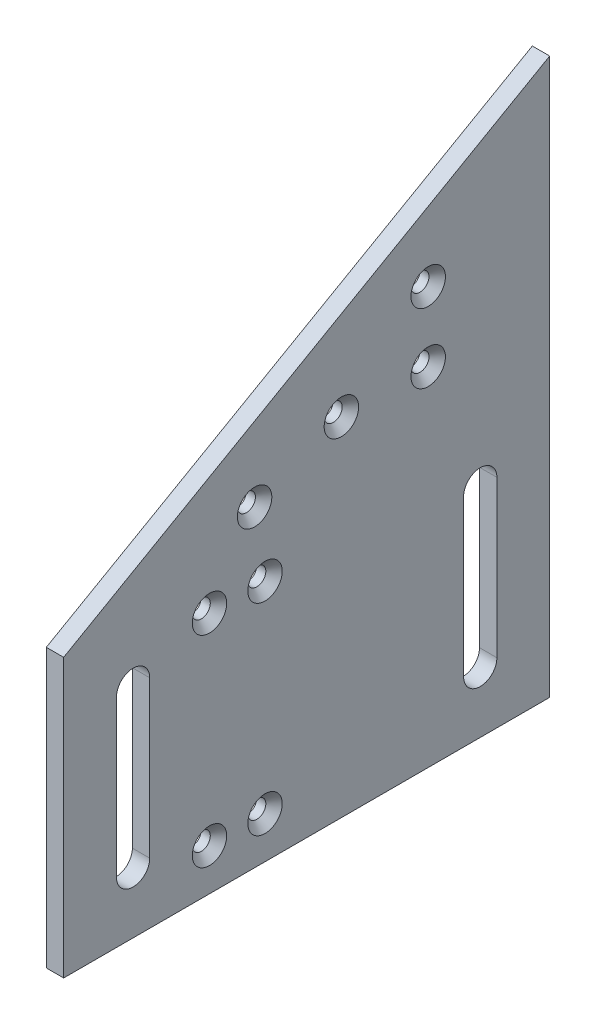
ISO-10303-21;
HEADER;
FILE_DESCRIPTION(('STEP AP214'),'2;1');
FILE_NAME('part.step','',(''),(''),'','','');
FILE_SCHEMA(('AUTOMOTIVE_DESIGN { 1 0 10303 214 1 1 1 1 }'));
ENDSEC;
DATA;
#1=APPLICATION_CONTEXT('core data for automotive mechanical design processes');
#2=APPLICATION_PROTOCOL_DEFINITION('international standard','automotive_design',2000,#1);
#3=PRODUCT_CONTEXT('',#1,'mechanical');
#4=PRODUCT('Part','Part','',(#3));
#5=PRODUCT_RELATED_PRODUCT_CATEGORY('part','',(#4));
#6=PRODUCT_DEFINITION_FORMATION('','',#4);
#7=PRODUCT_DEFINITION_CONTEXT('part definition',#1,'design');
#8=PRODUCT_DEFINITION('design','',#6,#7);
#9=PRODUCT_DEFINITION_SHAPE('','',#8);
#10=(LENGTH_UNIT() NAMED_UNIT(*) SI_UNIT(.MILLI.,.METRE.));
#11=(NAMED_UNIT(*) PLANE_ANGLE_UNIT() SI_UNIT($,.RADIAN.));
#12=(NAMED_UNIT(*) SI_UNIT($,.STERADIAN.) SOLID_ANGLE_UNIT());
#13=UNCERTAINTY_MEASURE_WITH_UNIT(LENGTH_MEASURE(1.E-05),#10,'distance_accuracy_value','');
#14=(GEOMETRIC_REPRESENTATION_CONTEXT(3) GLOBAL_UNCERTAINTY_ASSIGNED_CONTEXT((#13)) GLOBAL_UNIT_ASSIGNED_CONTEXT((#10,
#11,#12)) REPRESENTATION_CONTEXT('',''));
#15=CARTESIAN_POINT('',(0.,0.,0.));
#16=DIRECTION('',(0.,0.,1.));
#17=DIRECTION('',(1.,0.,0.));
#18=AXIS2_PLACEMENT_3D('',#15,#16,#17);
#19=CARTESIAN_POINT('',(6.35,22.225,-17.4843844536032));
#20=DIRECTION('',(-1.,0.,0.));
#21=DIRECTION('',(0.,0.,1.));
#22=AXIS2_PLACEMENT_3D('',#19,#20,#21);
#23=CYLINDRICAL_SURFACE('',#22,6.08383233532937);
#24=CARTESIAN_POINT('',(0.,22.225,-17.4843844536032));
#25=DIRECTION('',(1.,0.,0.));
#26=DIRECTION('',(0.,0.,-1.));
#27=AXIS2_PLACEMENT_3D('',#24,#25,#26);
#28=CIRCLE('',#27,6.08383233532937);
#29=CARTESIAN_POINT('',(0.,22.225,-23.5682167889326));
#30=VERTEX_POINT('',#29);
#31=CARTESIAN_POINT('',(0.,22.225,-11.4005521182738));
#32=VERTEX_POINT('',#31);
#33=EDGE_CURVE('E188',#30,#32,#28,.F.);
#34=ORIENTED_EDGE('',*,*,#33,.T.);
#35=DIRECTION('',(-1.,0.,0.));
#36=VECTOR('',#35,1.);
#37=CARTESIAN_POINT('',(6.35,22.225,-11.4005521182738));
#38=LINE('',#37,#36);
#39=CARTESIAN_POINT('',(6.35,22.225,-11.4005521182738));
#40=VERTEX_POINT('',#39);
#41=EDGE_CURVE('E11',#40,#32,#38,.T.);
#42=ORIENTED_EDGE('',*,*,#41,.F.);
#43=CARTESIAN_POINT('',(6.35,22.225,-17.4843844536032));
#44=DIRECTION('',(1.,0.,0.));
#45=DIRECTION('',(0.,0.,-1.));
#46=AXIS2_PLACEMENT_3D('',#43,#44,#45);
#47=CIRCLE('',#46,6.08383233532937);
#48=CARTESIAN_POINT('',(6.35,22.225,-23.5682167889326));
#49=VERTEX_POINT('',#48);
#50=EDGE_CURVE('E146',#49,#40,#47,.F.);
#51=ORIENTED_EDGE('',*,*,#50,.F.);
#52=DIRECTION('',(-1.,0.,0.));
#53=VECTOR('',#52,1.);
#54=CARTESIAN_POINT('',(6.35,22.225,-23.5682167889326));
#55=LINE('',#54,#53);
#56=EDGE_CURVE('E62',#49,#30,#55,.T.);
#57=ORIENTED_EDGE('',*,*,#56,.T.);
#58=EDGE_LOOP('',(#34,#42,#51,#57));
#59=FACE_BOUND('',#58,.T.);
#60=ADVANCED_FACE('F43',(#59),#23,.F.);
#61=CARTESIAN_POINT('',(6.35,0.,-11.4005521182738));
#62=DIRECTION('',(0.,0.,1.));
#63=DIRECTION('',(0.,-1.,0.));
#64=AXIS2_PLACEMENT_3D('',#61,#62,#63);
#65=PLANE('',#64);
#66=DIRECTION('',(0.,1.,0.));
#67=VECTOR('',#66,1.);
#68=CARTESIAN_POINT('',(0.,0.,-11.4005521182738));
#69=LINE('',#68,#67);
#70=CARTESIAN_POINT('',(0.,79.375,-11.4005521182738));
#71=VERTEX_POINT('',#70);
#72=EDGE_CURVE('E152',#32,#71,#69,.T.);
#73=ORIENTED_EDGE('',*,*,#72,.T.);
#74=DIRECTION('',(-1.,0.,0.));
#75=VECTOR('',#74,1.);
#76=CARTESIAN_POINT('',(6.35,79.375,-11.4005521182738));
#77=LINE('',#76,#75);
#78=CARTESIAN_POINT('',(6.35,79.375,-11.4005521182738));
#79=VERTEX_POINT('',#78);
#80=EDGE_CURVE('E53',#79,#71,#77,.T.);
#81=ORIENTED_EDGE('',*,*,#80,.F.);
#82=DIRECTION('',(0.,1.,0.));
#83=VECTOR('',#82,1.);
#84=CARTESIAN_POINT('',(6.35,0.,-11.4005521182738));
#85=LINE('',#84,#83);
#86=EDGE_CURVE('E140',#40,#79,#85,.T.);
#87=ORIENTED_EDGE('',*,*,#86,.F.);
#88=ORIENTED_EDGE('',*,*,#41,.T.);
#89=EDGE_LOOP('',(#73,#81,#87,#88));
#90=FACE_BOUND('',#89,.T.);
#91=ADVANCED_FACE('F151',(#90),#65,.F.);
#92=CARTESIAN_POINT('',(6.35,79.375,-17.4843844536032));
#93=DIRECTION('',(-1.,0.,0.));
#94=DIRECTION('',(0.,0.,1.));
#95=AXIS2_PLACEMENT_3D('',#92,#93,#94);
#96=CYLINDRICAL_SURFACE('',#95,6.08383233532938);
#97=CARTESIAN_POINT('',(0.,79.375,-17.4843844536032));
#98=DIRECTION('',(1.,0.,0.));
#99=DIRECTION('',(0.,0.,-1.));
#100=AXIS2_PLACEMENT_3D('',#97,#98,#99);
#101=CIRCLE('',#100,6.08383233532938);
#102=CARTESIAN_POINT('',(0.,79.375,-23.5682167889326));
#103=VERTEX_POINT('',#102);
#104=EDGE_CURVE('E191',#71,#103,#101,.F.);
#105=ORIENTED_EDGE('',*,*,#104,.T.);
#106=DIRECTION('',(-1.,0.,0.));
#107=VECTOR('',#106,1.);
#108=CARTESIAN_POINT('',(6.35,79.375,-23.5682167889326));
#109=LINE('',#108,#107);
#110=CARTESIAN_POINT('',(6.35,79.375,-23.5682167889326));
#111=VERTEX_POINT('',#110);
#112=EDGE_CURVE('E101',#111,#103,#109,.T.);
#113=ORIENTED_EDGE('',*,*,#112,.F.);
#114=CARTESIAN_POINT('',(6.35,79.375,-17.4843844536032));
#115=DIRECTION('',(1.,0.,0.));
#116=DIRECTION('',(0.,0.,-1.));
#117=AXIS2_PLACEMENT_3D('',#114,#115,#116);
#118=CIRCLE('',#117,6.08383233532938);
#119=EDGE_CURVE('E145',#79,#111,#118,.F.);
#120=ORIENTED_EDGE('',*,*,#119,.F.);
#121=ORIENTED_EDGE('',*,*,#80,.T.);
#122=EDGE_LOOP('',(#105,#113,#120,#121));
#123=FACE_BOUND('',#122,.T.);
#124=ADVANCED_FACE('F156',(#123),#96,.F.);
#125=CARTESIAN_POINT('',(6.35,0.,103.431783211067));
#126=DIRECTION('',(0.,0.,1.));
#127=DIRECTION('',(1.,0.,0.));
#128=AXIS2_PLACEMENT_3D('',#125,#126,#127);
#129=PLANE('',#128);
#130=DIRECTION('',(0.,1.,0.));
#131=VECTOR('',#130,1.);
#132=CARTESIAN_POINT('',(0.,0.,103.431783211067));
#133=LINE('',#132,#131);
#134=CARTESIAN_POINT('',(0.,22.225,103.431783211067));
#135=VERTEX_POINT('',#134);
#136=CARTESIAN_POINT('',(0.,79.375,103.431783211067));
#137=VERTEX_POINT('',#136);
#138=EDGE_CURVE('E176',#135,#137,#133,.T.);
#139=ORIENTED_EDGE('',*,*,#138,.F.);
#140=DIRECTION('',(-1.,0.,0.));
#141=VECTOR('',#140,1.);
#142=CARTESIAN_POINT('',(6.35,22.225,103.431783211067));
#143=LINE('',#142,#141);
#144=CARTESIAN_POINT('',(6.35,22.225,103.431783211067));
#145=VERTEX_POINT('',#144);
#146=EDGE_CURVE('E198',#145,#135,#143,.T.);
#147=ORIENTED_EDGE('',*,*,#146,.F.);
#148=DIRECTION('',(0.,1.,0.));
#149=VECTOR('',#148,1.);
#150=CARTESIAN_POINT('',(6.35,0.,103.431783211067));
#151=LINE('',#150,#149);
#152=CARTESIAN_POINT('',(6.35,79.375,103.431783211067));
#153=VERTEX_POINT('',#152);
#154=EDGE_CURVE('E234',#145,#153,#151,.T.);
#155=ORIENTED_EDGE('',*,*,#154,.T.);
#156=DIRECTION('',(-1.,0.,0.));
#157=VECTOR('',#156,1.);
#158=CARTESIAN_POINT('',(6.35,79.375,103.431783211067));
#159=LINE('',#158,#157);
#160=EDGE_CURVE('E200',#153,#137,#159,.T.);
#161=ORIENTED_EDGE('',*,*,#160,.T.);
#162=EDGE_LOOP('',(#139,#147,#155,#161));
#163=FACE_BOUND('',#162,.T.);
#164=ADVANCED_FACE('F262',(#163),#129,.T.);
#165=CARTESIAN_POINT('',(6.35,22.225,109.515615546397));
#166=DIRECTION('',(-1.,0.,0.));
#167=DIRECTION('',(0.,0.,1.));
#168=AXIS2_PLACEMENT_3D('',#165,#166,#167);
#169=CYLINDRICAL_SURFACE('',#168,6.08383233532937);
#170=CARTESIAN_POINT('',(0.,22.225,109.515615546397));
#171=DIRECTION('',(1.,0.,0.));
#172=DIRECTION('',(0.,0.,-1.));
#173=AXIS2_PLACEMENT_3D('',#170,#171,#172);
#174=CIRCLE('',#173,6.08383233532937);
#175=CARTESIAN_POINT('',(0.,22.225,115.599447881726));
#176=VERTEX_POINT('',#175);
#177=EDGE_CURVE('E179',#176,#135,#174,.T.);
#178=ORIENTED_EDGE('',*,*,#177,.F.);
#179=DIRECTION('',(-1.,0.,0.));
#180=VECTOR('',#179,1.);
#181=CARTESIAN_POINT('',(6.35,22.225,115.599447881726));
#182=LINE('',#181,#180);
#183=CARTESIAN_POINT('',(6.35,22.225,115.599447881726));
#184=VERTEX_POINT('',#183);
#185=EDGE_CURVE('E204',#184,#176,#182,.T.);
#186=ORIENTED_EDGE('',*,*,#185,.F.);
#187=CARTESIAN_POINT('',(6.35,22.225,109.515615546397));
#188=DIRECTION('',(1.,0.,0.));
#189=DIRECTION('',(0.,0.,-1.));
#190=AXIS2_PLACEMENT_3D('',#187,#188,#189);
#191=CIRCLE('',#190,6.08383233532937);
#192=EDGE_CURVE('E237',#184,#145,#191,.T.);
#193=ORIENTED_EDGE('',*,*,#192,.T.);
#194=ORIENTED_EDGE('',*,*,#146,.T.);
#195=EDGE_LOOP('',(#178,#186,#193,#194));
#196=FACE_BOUND('',#195,.T.);
#197=ADVANCED_FACE('F264',(#196),#169,.F.);
#198=CARTESIAN_POINT('',(6.35,0.,115.599447881726));
#199=DIRECTION('',(0.,0.,1.));
#200=DIRECTION('',(1.,0.,0.));
#201=AXIS2_PLACEMENT_3D('',#198,#199,#200);
#202=PLANE('',#201);
#203=DIRECTION('',(0.,1.,0.));
#204=VECTOR('',#203,1.);
#205=CARTESIAN_POINT('',(0.,0.,115.599447881726));
#206=LINE('',#205,#204);
#207=CARTESIAN_POINT('',(0.,79.375,115.599447881726));
#208=VERTEX_POINT('',#207);
#209=EDGE_CURVE('E182',#176,#208,#206,.T.);
#210=ORIENTED_EDGE('',*,*,#209,.T.);
#211=DIRECTION('',(-1.,0.,0.));
#212=VECTOR('',#211,1.);
#213=CARTESIAN_POINT('',(6.35,79.375,115.599447881726));
#214=LINE('',#213,#212);
#215=CARTESIAN_POINT('',(6.35,79.375,115.599447881726));
#216=VERTEX_POINT('',#215);
#217=EDGE_CURVE('E202',#216,#208,#214,.T.);
#218=ORIENTED_EDGE('',*,*,#217,.F.);
#219=DIRECTION('',(0.,1.,0.));
#220=VECTOR('',#219,1.);
#221=CARTESIAN_POINT('',(6.35,0.,115.599447881726));
#222=LINE('',#221,#220);
#223=EDGE_CURVE('E243',#184,#216,#222,.T.);
#224=ORIENTED_EDGE('',*,*,#223,.F.);
#225=ORIENTED_EDGE('',*,*,#185,.T.);
#226=EDGE_LOOP('',(#210,#218,#224,#225));
#227=FACE_BOUND('',#226,.T.);
#228=ADVANCED_FACE('F256',(#227),#202,.F.);
#229=CARTESIAN_POINT('',(6.35,134.708265158448,76.9761515191131));
#230=DIRECTION('',(0.,0.868243142124459,0.496138938356834));
#231=DIRECTION('',(0.,-0.496138938356834,0.868243142124459));
#232=AXIS2_PLACEMENT_3D('',#229,#230,#231);
#233=PLANE('',#232);
#234=DIRECTION('',(0.,0.496138938356834,-0.868243142124459));
#235=VECTOR('',#234,1.);
#236=CARTESIAN_POINT('',(0.,134.708265158448,76.9761515191131));
#237=LINE('',#236,#235);
#238=CARTESIAN_POINT('',(0.,101.6,134.915615546397));
#239=VERTEX_POINT('',#238);
#240=CARTESIAN_POINT('',(0.,203.2,-42.8843844536032));
#241=VERTEX_POINT('',#240);
#242=EDGE_CURVE('E163',#239,#241,#237,.T.);
#243=ORIENTED_EDGE('',*,*,#242,.F.);
#244=DIRECTION('',(-1.,0.,0.));
#245=VECTOR('',#244,1.);
#246=CARTESIAN_POINT('',(6.35,101.6,134.915615546397));
#247=LINE('',#246,#245);
#248=CARTESIAN_POINT('',(6.35,101.6,134.915615546397));
#249=VERTEX_POINT('',#248);
#250=EDGE_CURVE('E47',#249,#239,#247,.T.);
#251=ORIENTED_EDGE('',*,*,#250,.F.);
#252=DIRECTION('',(0.,0.496138938356834,-0.868243142124459));
#253=VECTOR('',#252,1.);
#254=CARTESIAN_POINT('',(6.35,134.708265158448,76.9761515191131));
#255=LINE('',#254,#253);
#256=CARTESIAN_POINT('',(6.35,203.2,-42.8843844536032));
#257=VERTEX_POINT('',#256);
#258=EDGE_CURVE('E196',#249,#257,#255,.T.);
#259=ORIENTED_EDGE('',*,*,#258,.T.);
#260=DIRECTION('',(-1.,0.,0.));
#261=VECTOR('',#260,1.);
#262=CARTESIAN_POINT('',(6.35,203.2,-42.8843844536032));
#263=LINE('',#262,#261);
#264=EDGE_CURVE('E159',#257,#241,#263,.T.);
#265=ORIENTED_EDGE('',*,*,#264,.T.);
#266=EDGE_LOOP('',(#243,#251,#259,#265));
#267=FACE_BOUND('',#266,.T.);
#268=ADVANCED_FACE('F45',(#267),#233,.T.);
#269=CARTESIAN_POINT('',(6.35,0.,134.915615546397));
#270=DIRECTION('',(0.,0.,1.));
#271=DIRECTION('',(1.,0.,0.));
#272=AXIS2_PLACEMENT_3D('',#269,#270,#271);
#273=PLANE('',#272);
#274=DIRECTION('',(0.,1.,0.));
#275=VECTOR('',#274,1.);
#276=CARTESIAN_POINT('',(0.,0.,134.915615546397));
#277=LINE('',#276,#275);
#278=CARTESIAN_POINT('',(0.,0.,134.915615546397));
#279=VERTEX_POINT('',#278);
#280=EDGE_CURVE('E166',#279,#239,#277,.T.);
#281=ORIENTED_EDGE('',*,*,#280,.F.);
#282=DIRECTION('',(-1.,0.,0.));
#283=VECTOR('',#282,1.);
#284=CARTESIAN_POINT('',(6.35,0.,134.915615546397));
#285=LINE('',#284,#283);
#286=CARTESIAN_POINT('',(6.35,0.,134.915615546397));
#287=VERTEX_POINT('',#286);
#288=EDGE_CURVE('E209',#287,#279,#285,.T.);
#289=ORIENTED_EDGE('',*,*,#288,.F.);
#290=DIRECTION('',(0.,1.,0.));
#291=VECTOR('',#290,1.);
#292=CARTESIAN_POINT('',(6.35,0.,134.915615546397));
#293=LINE('',#292,#291);
#294=EDGE_CURVE('E218',#287,#249,#293,.T.);
#295=ORIENTED_EDGE('',*,*,#294,.T.);
#296=ORIENTED_EDGE('',*,*,#250,.T.);
#297=EDGE_LOOP('',(#281,#289,#295,#296));
#298=FACE_BOUND('',#297,.T.);
#299=ADVANCED_FACE('F216',(#298),#273,.T.);
#300=CARTESIAN_POINT('',(6.35,0.,0.));
#301=DIRECTION('',(0.,-1.,0.));
#302=DIRECTION('',(0.,0.,-1.));
#303=AXIS2_PLACEMENT_3D('',#300,#301,#302);
#304=PLANE('',#303);
#305=DIRECTION('',(0.,0.,1.));
#306=VECTOR('',#305,1.);
#307=CARTESIAN_POINT('',(0.,0.,0.));
#308=LINE('',#307,#306);
#309=CARTESIAN_POINT('',(0.,0.,-42.8843844536032));
#310=VERTEX_POINT('',#309);
#311=EDGE_CURVE('E170',#310,#279,#308,.T.);
#312=ORIENTED_EDGE('',*,*,#311,.F.);
#313=DIRECTION('',(-1.,0.,0.));
#314=VECTOR('',#313,1.);
#315=CARTESIAN_POINT('',(6.35,0.,-42.8843844536032));
#316=LINE('',#315,#314);
#317=CARTESIAN_POINT('',(6.35,0.,-42.8843844536032));
#318=VERTEX_POINT('',#317);
#319=EDGE_CURVE('E208',#318,#310,#316,.T.);
#320=ORIENTED_EDGE('',*,*,#319,.F.);
#321=DIRECTION('',(0.,0.,1.));
#322=VECTOR('',#321,1.);
#323=CARTESIAN_POINT('',(6.35,0.,0.));
#324=LINE('',#323,#322);
#325=EDGE_CURVE('E225',#318,#287,#324,.T.);
#326=ORIENTED_EDGE('',*,*,#325,.T.);
#327=ORIENTED_EDGE('',*,*,#288,.T.);
#328=EDGE_LOOP('',(#312,#320,#326,#327));
#329=FACE_BOUND('',#328,.T.);
#330=ADVANCED_FACE('F223',(#329),#304,.T.);
#331=CARTESIAN_POINT('',(6.35,79.375,109.515615546397));
#332=DIRECTION('',(-1.,0.,0.));
#333=DIRECTION('',(0.,0.,1.));
#334=AXIS2_PLACEMENT_3D('',#331,#332,#333);
#335=CYLINDRICAL_SURFACE('',#334,6.08383233532937);
#336=CARTESIAN_POINT('',(0.,79.375,109.515615546397));
#337=DIRECTION('',(1.,0.,0.));
#338=DIRECTION('',(0.,0.,-1.));
#339=AXIS2_PLACEMENT_3D('',#336,#337,#338);
#340=CIRCLE('',#339,6.08383233532937);
#341=EDGE_CURVE('E185',#137,#208,#340,.T.);
#342=ORIENTED_EDGE('',*,*,#341,.F.);
#343=ORIENTED_EDGE('',*,*,#160,.F.);
#344=CARTESIAN_POINT('',(6.35,79.375,109.515615546397));
#345=DIRECTION('',(1.,0.,0.));
#346=DIRECTION('',(0.,0.,-1.));
#347=AXIS2_PLACEMENT_3D('',#344,#345,#346);
#348=CIRCLE('',#347,6.08383233532937);
#349=EDGE_CURVE('E245',#153,#216,#348,.T.);
#350=ORIENTED_EDGE('',*,*,#349,.T.);
#351=ORIENTED_EDGE('',*,*,#217,.T.);
#352=EDGE_LOOP('',(#342,#343,#350,#351));
#353=FACE_BOUND('',#352,.T.);
#354=ADVANCED_FACE('F250',(#353),#335,.F.);
#355=CARTESIAN_POINT('',(6.35,0.,-42.8843844536032));
#356=DIRECTION('',(0.,0.,-1.));
#357=DIRECTION('',(0.,1.,0.));
#358=AXIS2_PLACEMENT_3D('',#355,#356,#357);
#359=PLANE('',#358);
#360=DIRECTION('',(0.,-1.,0.));
#361=VECTOR('',#360,1.);
#362=CARTESIAN_POINT('',(0.,0.,-42.8843844536032));
#363=LINE('',#362,#361);
#364=EDGE_CURVE('E173',#241,#310,#363,.T.);
#365=ORIENTED_EDGE('',*,*,#364,.F.);
#366=ORIENTED_EDGE('',*,*,#264,.F.);
#367=DIRECTION('',(0.,-1.,0.));
#368=VECTOR('',#367,1.);
#369=CARTESIAN_POINT('',(6.35,0.,-42.8843844536032));
#370=LINE('',#369,#368);
#371=EDGE_CURVE('E231',#257,#318,#370,.T.);
#372=ORIENTED_EDGE('',*,*,#371,.T.);
#373=ORIENTED_EDGE('',*,*,#319,.T.);
#374=EDGE_LOOP('',(#365,#366,#372,#373));
#375=FACE_BOUND('',#374,.T.);
#376=ADVANCED_FACE('F233',(#375),#359,.T.);
#377=CARTESIAN_POINT('',(6.35,0.,-23.5682167889326));
#378=DIRECTION('',(0.,0.,1.));
#379=DIRECTION('',(1.,0.,0.));
#380=AXIS2_PLACEMENT_3D('',#377,#378,#379);
#381=PLANE('',#380);
#382=DIRECTION('',(0.,1.,0.));
#383=VECTOR('',#382,1.);
#384=CARTESIAN_POINT('',(0.,0.,-23.5682167889326));
#385=LINE('',#384,#383);
#386=EDGE_CURVE('E193',#30,#103,#385,.T.);
#387=ORIENTED_EDGE('',*,*,#386,.F.);
#388=ORIENTED_EDGE('',*,*,#56,.F.);
#389=DIRECTION('',(0.,1.,0.));
#390=VECTOR('',#389,1.);
#391=CARTESIAN_POINT('',(6.35,0.,-23.5682167889326));
#392=LINE('',#391,#390);
#393=EDGE_CURVE('E157',#49,#111,#392,.T.);
#394=ORIENTED_EDGE('',*,*,#393,.T.);
#395=ORIENTED_EDGE('',*,*,#112,.T.);
#396=EDGE_LOOP('',(#387,#388,#394,#395));
#397=FACE_BOUND('',#396,.T.);
#398=ADVANCED_FACE('F286',(#397),#381,.T.);
#399=CARTESIAN_POINT('',(6.35,0.,0.));
#400=DIRECTION('',(1.,0.,0.));
#401=DIRECTION('',(0.,0.,-1.));
#402=AXIS2_PLACEMENT_3D('',#399,#400,#401);
#403=PLANE('',#402);
#404=CARTESIAN_POINT('',(6.35,127.,33.3156155463968));
#405=DIRECTION('',(1.,0.,0.));
#406=DIRECTION('',(0.,0.,-1.));
#407=AXIS2_PLACEMENT_3D('',#404,#405,#406);
#408=CIRCLE('',#407,6.3);
#409=CARTESIAN_POINT('',(6.35,127.,27.0156155463968));
#410=VERTEX_POINT('',#409);
#411=EDGE_CURVE('E413',#410,#410,#408,.T.);
#412=ORIENTED_EDGE('',*,*,#411,.F.);
#413=EDGE_LOOP('',(#412));
#414=FACE_BOUND('',#413,.T.);
#415=CARTESIAN_POINT('',(6.35,127.,1.5656155463968));
#416=DIRECTION('',(1.,0.,0.));
#417=DIRECTION('',(0.,0.,-1.));
#418=AXIS2_PLACEMENT_3D('',#415,#416,#417);
#419=CIRCLE('',#418,6.3);
#420=CARTESIAN_POINT('',(6.35,127.,-4.7343844536032));
#421=VERTEX_POINT('',#420);
#422=EDGE_CURVE('E420',#421,#421,#419,.T.);
#423=ORIENTED_EDGE('',*,*,#422,.F.);
#424=EDGE_LOOP('',(#423));
#425=FACE_BOUND('',#424,.T.);
#426=CARTESIAN_POINT('',(6.35,152.4,1.5656155463968));
#427=DIRECTION('',(1.,0.,0.));
#428=DIRECTION('',(0.,0.,-1.));
#429=AXIS2_PLACEMENT_3D('',#426,#427,#428);
#430=CIRCLE('',#429,6.3);
#431=CARTESIAN_POINT('',(6.35,152.4,-4.7343844536032));
#432=VERTEX_POINT('',#431);
#433=EDGE_CURVE('E429',#432,#432,#430,.T.);
#434=ORIENTED_EDGE('',*,*,#433,.F.);
#435=EDGE_LOOP('',(#434));
#436=FACE_BOUND('',#435,.T.);
#437=CARTESIAN_POINT('',(6.35,114.3,65.0656155463968));
#438=DIRECTION('',(1.,0.,0.));
#439=DIRECTION('',(0.,0.,-1.));
#440=AXIS2_PLACEMENT_3D('',#437,#438,#439);
#441=CIRCLE('',#440,6.3);
#442=CARTESIAN_POINT('',(6.35,114.3,58.7656155463968));
#443=VERTEX_POINT('',#442);
#444=EDGE_CURVE('E438',#443,#443,#441,.T.);
#445=ORIENTED_EDGE('',*,*,#444,.F.);
#446=EDGE_LOOP('',(#445));
#447=FACE_BOUND('',#446,.T.);
#448=CARTESIAN_POINT('',(6.35,88.9,81.5756155463968));
#449=DIRECTION('',(1.,0.,0.));
#450=DIRECTION('',(0.,0.,-1.));
#451=AXIS2_PLACEMENT_3D('',#448,#449,#450);
#452=CIRCLE('',#451,6.3);
#453=CARTESIAN_POINT('',(6.35,88.9,75.2756155463968));
#454=VERTEX_POINT('',#453);
#455=EDGE_CURVE('E447',#454,#454,#452,.T.);
#456=ORIENTED_EDGE('',*,*,#455,.F.);
#457=EDGE_LOOP('',(#456));
#458=FACE_BOUND('',#457,.T.);
#459=CARTESIAN_POINT('',(6.35,88.9,61.2556155463968));
#460=DIRECTION('',(1.,0.,0.));
#461=DIRECTION('',(0.,0.,-1.));
#462=AXIS2_PLACEMENT_3D('',#459,#460,#461);
#463=CIRCLE('',#462,6.3);
#464=CARTESIAN_POINT('',(6.35,88.9,54.9556155463968));
#465=VERTEX_POINT('',#464);
#466=EDGE_CURVE('E456',#465,#465,#463,.T.);
#467=ORIENTED_EDGE('',*,*,#466,.F.);
#468=EDGE_LOOP('',(#467));
#469=FACE_BOUND('',#468,.T.);
#470=CARTESIAN_POINT('',(6.35,15.24,61.2556155463968));
#471=DIRECTION('',(1.,0.,0.));
#472=DIRECTION('',(0.,0.,-1.));
#473=AXIS2_PLACEMENT_3D('',#470,#471,#472);
#474=CIRCLE('',#473,6.3);
#475=CARTESIAN_POINT('',(6.35,15.24,54.9556155463968));
#476=VERTEX_POINT('',#475);
#477=EDGE_CURVE('E465',#476,#476,#474,.T.);
#478=ORIENTED_EDGE('',*,*,#477,.F.);
#479=EDGE_LOOP('',(#478));
#480=FACE_BOUND('',#479,.T.);
#481=CARTESIAN_POINT('',(6.35,15.24,81.5756155463968));
#482=DIRECTION('',(1.,0.,0.));
#483=DIRECTION('',(0.,0.,-1.));
#484=AXIS2_PLACEMENT_3D('',#481,#482,#483);
#485=CIRCLE('',#484,6.3);
#486=CARTESIAN_POINT('',(6.35,15.24,75.2756155463968));
#487=VERTEX_POINT('',#486);
#488=EDGE_CURVE('E474',#487,#487,#485,.T.);
#489=ORIENTED_EDGE('',*,*,#488,.F.);
#490=EDGE_LOOP('',(#489));
#491=FACE_BOUND('',#490,.T.);
#492=ORIENTED_EDGE('',*,*,#258,.F.);
#493=ORIENTED_EDGE('',*,*,#294,.F.);
#494=ORIENTED_EDGE('',*,*,#325,.F.);
#495=ORIENTED_EDGE('',*,*,#371,.F.);
#496=EDGE_LOOP('',(#492,#493,#494,#495));
#497=FACE_BOUND('',#496,.T.);
#498=ORIENTED_EDGE('',*,*,#154,.F.);
#499=ORIENTED_EDGE('',*,*,#192,.F.);
#500=ORIENTED_EDGE('',*,*,#223,.T.);
#501=ORIENTED_EDGE('',*,*,#349,.F.);
#502=EDGE_LOOP('',(#498,#499,#500,#501));
#503=FACE_BOUND('',#502,.T.);
#504=ORIENTED_EDGE('',*,*,#50,.T.);
#505=ORIENTED_EDGE('',*,*,#86,.T.);
#506=ORIENTED_EDGE('',*,*,#119,.T.);
#507=ORIENTED_EDGE('',*,*,#393,.F.);
#508=EDGE_LOOP('',(#504,#505,#506,#507));
#509=FACE_BOUND('',#508,.T.);
#510=ADVANCED_FACE('F142',(#414,#425,#436,#447,#458,#469,#480,#491,#497,#503,#509),#403,.T.);
#511=CARTESIAN_POINT('',(0.,0.,0.));
#512=DIRECTION('',(1.,0.,0.));
#513=DIRECTION('',(0.,0.,-1.));
#514=AXIS2_PLACEMENT_3D('',#511,#512,#513);
#515=PLANE('',#514);
#516=CARTESIAN_POINT('',(0.,127.,33.3156155463968));
#517=DIRECTION('',(1.,0.,0.));
#518=DIRECTION('',(0.,0.,-1.));
#519=AXIS2_PLACEMENT_3D('',#516,#517,#518);
#520=CIRCLE('',#519,3.3);
#521=CARTESIAN_POINT('',(0.,127.,30.0156155463968));
#522=VERTEX_POINT('',#521);
#523=EDGE_CURVE('E415',#522,#522,#520,.T.);
#524=ORIENTED_EDGE('',*,*,#523,.T.);
#525=EDGE_LOOP('',(#524));
#526=FACE_BOUND('',#525,.T.);
#527=CARTESIAN_POINT('',(0.,127.,1.5656155463968));
#528=DIRECTION('',(1.,0.,0.));
#529=DIRECTION('',(0.,0.,-1.));
#530=AXIS2_PLACEMENT_3D('',#527,#528,#529);
#531=CIRCLE('',#530,3.3);
#532=CARTESIAN_POINT('',(0.,127.,-1.7343844536032));
#533=VERTEX_POINT('',#532);
#534=EDGE_CURVE('E426',#533,#533,#531,.T.);
#535=ORIENTED_EDGE('',*,*,#534,.T.);
#536=EDGE_LOOP('',(#535));
#537=FACE_BOUND('',#536,.T.);
#538=CARTESIAN_POINT('',(0.,152.4,1.5656155463968));
#539=DIRECTION('',(1.,0.,0.));
#540=DIRECTION('',(0.,0.,-1.));
#541=AXIS2_PLACEMENT_3D('',#538,#539,#540);
#542=CIRCLE('',#541,3.3);
#543=CARTESIAN_POINT('',(0.,152.4,-1.7343844536032));
#544=VERTEX_POINT('',#543);
#545=EDGE_CURVE('E435',#544,#544,#542,.T.);
#546=ORIENTED_EDGE('',*,*,#545,.T.);
#547=EDGE_LOOP('',(#546));
#548=FACE_BOUND('',#547,.T.);
#549=CARTESIAN_POINT('',(0.,114.3,65.0656155463968));
#550=DIRECTION('',(1.,0.,0.));
#551=DIRECTION('',(0.,0.,-1.));
#552=AXIS2_PLACEMENT_3D('',#549,#550,#551);
#553=CIRCLE('',#552,3.3);
#554=CARTESIAN_POINT('',(0.,114.3,61.7656155463968));
#555=VERTEX_POINT('',#554);
#556=EDGE_CURVE('E444',#555,#555,#553,.T.);
#557=ORIENTED_EDGE('',*,*,#556,.T.);
#558=EDGE_LOOP('',(#557));
#559=FACE_BOUND('',#558,.T.);
#560=CARTESIAN_POINT('',(0.,88.9,81.5756155463968));
#561=DIRECTION('',(1.,0.,0.));
#562=DIRECTION('',(0.,0.,-1.));
#563=AXIS2_PLACEMENT_3D('',#560,#561,#562);
#564=CIRCLE('',#563,3.3);
#565=CARTESIAN_POINT('',(0.,88.9,78.2756155463968));
#566=VERTEX_POINT('',#565);
#567=EDGE_CURVE('E453',#566,#566,#564,.T.);
#568=ORIENTED_EDGE('',*,*,#567,.T.);
#569=EDGE_LOOP('',(#568));
#570=FACE_BOUND('',#569,.T.);
#571=CARTESIAN_POINT('',(0.,88.9,61.2556155463968));
#572=DIRECTION('',(1.,0.,0.));
#573=DIRECTION('',(0.,0.,-1.));
#574=AXIS2_PLACEMENT_3D('',#571,#572,#573);
#575=CIRCLE('',#574,3.3);
#576=CARTESIAN_POINT('',(0.,88.9,57.9556155463968));
#577=VERTEX_POINT('',#576);
#578=EDGE_CURVE('E462',#577,#577,#575,.T.);
#579=ORIENTED_EDGE('',*,*,#578,.T.);
#580=EDGE_LOOP('',(#579));
#581=FACE_BOUND('',#580,.T.);
#582=CARTESIAN_POINT('',(0.,15.24,61.2556155463968));
#583=DIRECTION('',(1.,0.,0.));
#584=DIRECTION('',(0.,0.,-1.));
#585=AXIS2_PLACEMENT_3D('',#582,#583,#584);
#586=CIRCLE('',#585,3.3);
#587=CARTESIAN_POINT('',(0.,15.24,57.9556155463968));
#588=VERTEX_POINT('',#587);
#589=EDGE_CURVE('E471',#588,#588,#586,.T.);
#590=ORIENTED_EDGE('',*,*,#589,.T.);
#591=EDGE_LOOP('',(#590));
#592=FACE_BOUND('',#591,.T.);
#593=CARTESIAN_POINT('',(0.,15.24,81.5756155463968));
#594=DIRECTION('',(1.,0.,0.));
#595=DIRECTION('',(0.,0.,-1.));
#596=AXIS2_PLACEMENT_3D('',#593,#594,#595);
#597=CIRCLE('',#596,3.3);
#598=CARTESIAN_POINT('',(0.,15.24,78.2756155463968));
#599=VERTEX_POINT('',#598);
#600=EDGE_CURVE('E167',#599,#599,#597,.T.);
#601=ORIENTED_EDGE('',*,*,#600,.T.);
#602=EDGE_LOOP('',(#601));
#603=FACE_BOUND('',#602,.T.);
#604=ORIENTED_EDGE('',*,*,#242,.T.);
#605=ORIENTED_EDGE('',*,*,#364,.T.);
#606=ORIENTED_EDGE('',*,*,#311,.T.);
#607=ORIENTED_EDGE('',*,*,#280,.T.);
#608=EDGE_LOOP('',(#604,#605,#606,#607));
#609=FACE_BOUND('',#608,.T.);
#610=ORIENTED_EDGE('',*,*,#138,.T.);
#611=ORIENTED_EDGE('',*,*,#341,.T.);
#612=ORIENTED_EDGE('',*,*,#209,.F.);
#613=ORIENTED_EDGE('',*,*,#177,.T.);
#614=EDGE_LOOP('',(#610,#611,#612,#613));
#615=FACE_BOUND('',#614,.T.);
#616=ORIENTED_EDGE('',*,*,#33,.F.);
#617=ORIENTED_EDGE('',*,*,#386,.T.);
#618=ORIENTED_EDGE('',*,*,#104,.F.);
#619=ORIENTED_EDGE('',*,*,#72,.F.);
#620=EDGE_LOOP('',(#616,#617,#618,#619));
#621=FACE_BOUND('',#620,.T.);
#622=ADVANCED_FACE('F221',(#526,#537,#548,#559,#570,#581,#592,#603,#609,#615,#621),#515,.F.);
#623=CARTESIAN_POINT('',(6.35,15.24,81.5756155463968));
#624=DIRECTION('',(1.,0.,0.));
#625=DIRECTION('',(0.,0.,-1.));
#626=AXIS2_PLACEMENT_3D('',#623,#624,#625);
#627=CYLINDRICAL_SURFACE('',#626,3.3);
#628=ORIENTED_EDGE('',*,*,#600,.F.);
#629=EDGE_LOOP('',(#628));
#630=FACE_BOUND('',#629,.T.);
#631=CARTESIAN_POINT('',(3.35,15.24,81.5756155463968));
#632=DIRECTION('',(1.,0.,0.));
#633=DIRECTION('',(0.,0.,-1.));
#634=AXIS2_PLACEMENT_3D('',#631,#632,#633);
#635=CIRCLE('',#634,3.3);
#636=CARTESIAN_POINT('',(3.35,15.24,78.2756155463968));
#637=VERTEX_POINT('',#636);
#638=EDGE_CURVE('E477',#637,#637,#635,.T.);
#639=ORIENTED_EDGE('',*,*,#638,.T.);
#640=EDGE_LOOP('',(#639));
#641=FACE_BOUND('',#640,.T.);
#642=ADVANCED_FACE('F338',(#630,#641),#627,.F.);
#643=CARTESIAN_POINT('',(6.35,15.24,81.5756155463968));
#644=DIRECTION('',(1.,0.,0.));
#645=DIRECTION('',(0.,0.,-1.));
#646=AXIS2_PLACEMENT_3D('',#643,#644,#645);
#647=CONICAL_SURFACE('',#646,6.3,0.785398163397449);
#648=ORIENTED_EDGE('',*,*,#638,.F.);
#649=EDGE_LOOP('',(#648));
#650=FACE_BOUND('',#649,.T.);
#651=ORIENTED_EDGE('',*,*,#488,.T.);
#652=EDGE_LOOP('',(#651));
#653=FACE_BOUND('',#652,.T.);
#654=ADVANCED_FACE('F345',(#650,#653),#647,.F.);
#655=CARTESIAN_POINT('',(6.35,15.24,61.2556155463968));
#656=DIRECTION('',(1.,0.,0.));
#657=DIRECTION('',(0.,0.,-1.));
#658=AXIS2_PLACEMENT_3D('',#655,#656,#657);
#659=CYLINDRICAL_SURFACE('',#658,3.3);
#660=ORIENTED_EDGE('',*,*,#589,.F.);
#661=EDGE_LOOP('',(#660));
#662=FACE_BOUND('',#661,.T.);
#663=CARTESIAN_POINT('',(3.35,15.24,61.2556155463968));
#664=DIRECTION('',(1.,0.,0.));
#665=DIRECTION('',(0.,0.,-1.));
#666=AXIS2_PLACEMENT_3D('',#663,#664,#665);
#667=CIRCLE('',#666,3.3);
#668=CARTESIAN_POINT('',(3.35,15.24,57.9556155463968));
#669=VERTEX_POINT('',#668);
#670=EDGE_CURVE('E468',#669,#669,#667,.T.);
#671=ORIENTED_EDGE('',*,*,#670,.T.);
#672=EDGE_LOOP('',(#671));
#673=FACE_BOUND('',#672,.T.);
#674=ADVANCED_FACE('F349',(#662,#673),#659,.F.);
#675=CARTESIAN_POINT('',(6.35,15.24,61.2556155463968));
#676=DIRECTION('',(1.,0.,0.));
#677=DIRECTION('',(0.,0.,-1.));
#678=AXIS2_PLACEMENT_3D('',#675,#676,#677);
#679=CONICAL_SURFACE('',#678,6.3,0.785398163397448);
#680=ORIENTED_EDGE('',*,*,#670,.F.);
#681=EDGE_LOOP('',(#680));
#682=FACE_BOUND('',#681,.T.);
#683=ORIENTED_EDGE('',*,*,#477,.T.);
#684=EDGE_LOOP('',(#683));
#685=FACE_BOUND('',#684,.T.);
#686=ADVANCED_FACE('F353',(#682,#685),#679,.F.);
#687=CARTESIAN_POINT('',(6.35,88.9,61.2556155463968));
#688=DIRECTION('',(1.,0.,0.));
#689=DIRECTION('',(0.,0.,-1.));
#690=AXIS2_PLACEMENT_3D('',#687,#688,#689);
#691=CYLINDRICAL_SURFACE('',#690,3.3);
#692=ORIENTED_EDGE('',*,*,#578,.F.);
#693=EDGE_LOOP('',(#692));
#694=FACE_BOUND('',#693,.T.);
#695=CARTESIAN_POINT('',(3.35,88.9,61.2556155463968));
#696=DIRECTION('',(1.,0.,0.));
#697=DIRECTION('',(0.,0.,-1.));
#698=AXIS2_PLACEMENT_3D('',#695,#696,#697);
#699=CIRCLE('',#698,3.3);
#700=CARTESIAN_POINT('',(3.35,88.9,57.9556155463968));
#701=VERTEX_POINT('',#700);
#702=EDGE_CURVE('E459',#701,#701,#699,.T.);
#703=ORIENTED_EDGE('',*,*,#702,.T.);
#704=EDGE_LOOP('',(#703));
#705=FACE_BOUND('',#704,.T.);
#706=ADVANCED_FACE('F357',(#694,#705),#691,.F.);
#707=CARTESIAN_POINT('',(6.35,88.9,61.2556155463968));
#708=DIRECTION('',(1.,0.,0.));
#709=DIRECTION('',(0.,0.,-1.));
#710=AXIS2_PLACEMENT_3D('',#707,#708,#709);
#711=CONICAL_SURFACE('',#710,6.3,0.785398163397449);
#712=ORIENTED_EDGE('',*,*,#702,.F.);
#713=EDGE_LOOP('',(#712));
#714=FACE_BOUND('',#713,.T.);
#715=ORIENTED_EDGE('',*,*,#466,.T.);
#716=EDGE_LOOP('',(#715));
#717=FACE_BOUND('',#716,.T.);
#718=ADVANCED_FACE('F361',(#714,#717),#711,.F.);
#719=CARTESIAN_POINT('',(6.35,88.9,81.5756155463968));
#720=DIRECTION('',(1.,0.,0.));
#721=DIRECTION('',(0.,0.,-1.));
#722=AXIS2_PLACEMENT_3D('',#719,#720,#721);
#723=CYLINDRICAL_SURFACE('',#722,3.3);
#724=ORIENTED_EDGE('',*,*,#567,.F.);
#725=EDGE_LOOP('',(#724));
#726=FACE_BOUND('',#725,.T.);
#727=CARTESIAN_POINT('',(3.35,88.9,81.5756155463968));
#728=DIRECTION('',(1.,0.,0.));
#729=DIRECTION('',(0.,0.,-1.));
#730=AXIS2_PLACEMENT_3D('',#727,#728,#729);
#731=CIRCLE('',#730,3.3);
#732=CARTESIAN_POINT('',(3.35,88.9,78.2756155463968));
#733=VERTEX_POINT('',#732);
#734=EDGE_CURVE('E450',#733,#733,#731,.T.);
#735=ORIENTED_EDGE('',*,*,#734,.T.);
#736=EDGE_LOOP('',(#735));
#737=FACE_BOUND('',#736,.T.);
#738=ADVANCED_FACE('F365',(#726,#737),#723,.F.);
#739=CARTESIAN_POINT('',(6.35,88.9,81.5756155463968));
#740=DIRECTION('',(1.,0.,0.));
#741=DIRECTION('',(0.,0.,-1.));
#742=AXIS2_PLACEMENT_3D('',#739,#740,#741);
#743=CONICAL_SURFACE('',#742,6.3,0.785398163397449);
#744=ORIENTED_EDGE('',*,*,#734,.F.);
#745=EDGE_LOOP('',(#744));
#746=FACE_BOUND('',#745,.T.);
#747=ORIENTED_EDGE('',*,*,#455,.T.);
#748=EDGE_LOOP('',(#747));
#749=FACE_BOUND('',#748,.T.);
#750=ADVANCED_FACE('F369',(#746,#749),#743,.F.);
#751=CARTESIAN_POINT('',(6.35,114.3,65.0656155463968));
#752=DIRECTION('',(1.,0.,0.));
#753=DIRECTION('',(0.,0.,-1.));
#754=AXIS2_PLACEMENT_3D('',#751,#752,#753);
#755=CYLINDRICAL_SURFACE('',#754,3.29999999999999);
#756=ORIENTED_EDGE('',*,*,#556,.F.);
#757=EDGE_LOOP('',(#756));
#758=FACE_BOUND('',#757,.T.);
#759=CARTESIAN_POINT('',(3.34999999999998,114.3,65.0656155463968));
#760=DIRECTION('',(1.,0.,0.));
#761=DIRECTION('',(0.,0.,-1.));
#762=AXIS2_PLACEMENT_3D('',#759,#760,#761);
#763=CIRCLE('',#762,3.29999999999998);
#764=CARTESIAN_POINT('',(3.34999999999998,114.3,61.7656155463968));
#765=VERTEX_POINT('',#764);
#766=EDGE_CURVE('E441',#765,#765,#763,.T.);
#767=ORIENTED_EDGE('',*,*,#766,.T.);
#768=EDGE_LOOP('',(#767));
#769=FACE_BOUND('',#768,.T.);
#770=ADVANCED_FACE('F373',(#758,#769),#755,.F.);
#771=CARTESIAN_POINT('',(6.35,114.3,65.0656155463968));
#772=DIRECTION('',(1.,0.,0.));
#773=DIRECTION('',(0.,0.,-1.));
#774=AXIS2_PLACEMENT_3D('',#771,#772,#773);
#775=CONICAL_SURFACE('',#774,6.3,0.785398163397448);
#776=ORIENTED_EDGE('',*,*,#766,.F.);
#777=EDGE_LOOP('',(#776));
#778=FACE_BOUND('',#777,.T.);
#779=ORIENTED_EDGE('',*,*,#444,.T.);
#780=EDGE_LOOP('',(#779));
#781=FACE_BOUND('',#780,.T.);
#782=ADVANCED_FACE('F377',(#778,#781),#775,.F.);
#783=CARTESIAN_POINT('',(6.35,152.4,1.5656155463968));
#784=DIRECTION('',(1.,0.,0.));
#785=DIRECTION('',(0.,0.,-1.));
#786=AXIS2_PLACEMENT_3D('',#783,#784,#785);
#787=CYLINDRICAL_SURFACE('',#786,3.3);
#788=ORIENTED_EDGE('',*,*,#545,.F.);
#789=EDGE_LOOP('',(#788));
#790=FACE_BOUND('',#789,.T.);
#791=CARTESIAN_POINT('',(3.34999999999998,152.4,1.5656155463968));
#792=DIRECTION('',(1.,0.,0.));
#793=DIRECTION('',(0.,0.,-1.));
#794=AXIS2_PLACEMENT_3D('',#791,#792,#793);
#795=CIRCLE('',#794,3.3);
#796=CARTESIAN_POINT('',(3.34999999999998,152.4,-1.7343844536032));
#797=VERTEX_POINT('',#796);
#798=EDGE_CURVE('E432',#797,#797,#795,.T.);
#799=ORIENTED_EDGE('',*,*,#798,.T.);
#800=EDGE_LOOP('',(#799));
#801=FACE_BOUND('',#800,.T.);
#802=ADVANCED_FACE('F381',(#790,#801),#787,.F.);
#803=CARTESIAN_POINT('',(6.35,152.4,1.5656155463968));
#804=DIRECTION('',(1.,0.,0.));
#805=DIRECTION('',(0.,0.,-1.));
#806=AXIS2_PLACEMENT_3D('',#803,#804,#805);
#807=CONICAL_SURFACE('',#806,6.3,0.785398163397446);
#808=ORIENTED_EDGE('',*,*,#798,.F.);
#809=EDGE_LOOP('',(#808));
#810=FACE_BOUND('',#809,.T.);
#811=ORIENTED_EDGE('',*,*,#433,.T.);
#812=EDGE_LOOP('',(#811));
#813=FACE_BOUND('',#812,.T.);
#814=ADVANCED_FACE('F385',(#810,#813),#807,.F.);
#815=CARTESIAN_POINT('',(6.35,127.,1.5656155463968));
#816=DIRECTION('',(1.,0.,0.));
#817=DIRECTION('',(0.,0.,-1.));
#818=AXIS2_PLACEMENT_3D('',#815,#816,#817);
#819=CYLINDRICAL_SURFACE('',#818,3.3);
#820=ORIENTED_EDGE('',*,*,#534,.F.);
#821=EDGE_LOOP('',(#820));
#822=FACE_BOUND('',#821,.T.);
#823=CARTESIAN_POINT('',(3.34999999999998,127.,1.5656155463968));
#824=DIRECTION('',(1.,0.,0.));
#825=DIRECTION('',(0.,0.,-1.));
#826=AXIS2_PLACEMENT_3D('',#823,#824,#825);
#827=CIRCLE('',#826,3.3);
#828=CARTESIAN_POINT('',(3.34999999999998,127.,-1.7343844536032));
#829=VERTEX_POINT('',#828);
#830=EDGE_CURVE('E423',#829,#829,#827,.T.);
#831=ORIENTED_EDGE('',*,*,#830,.T.);
#832=EDGE_LOOP('',(#831));
#833=FACE_BOUND('',#832,.T.);
#834=ADVANCED_FACE('F389',(#822,#833),#819,.F.);
#835=CARTESIAN_POINT('',(6.35,127.,1.5656155463968));
#836=DIRECTION('',(1.,0.,0.));
#837=DIRECTION('',(0.,0.,-1.));
#838=AXIS2_PLACEMENT_3D('',#835,#836,#837);
#839=CONICAL_SURFACE('',#838,6.3,0.785398163397446);
#840=ORIENTED_EDGE('',*,*,#830,.F.);
#841=EDGE_LOOP('',(#840));
#842=FACE_BOUND('',#841,.T.);
#843=ORIENTED_EDGE('',*,*,#422,.T.);
#844=EDGE_LOOP('',(#843));
#845=FACE_BOUND('',#844,.T.);
#846=ADVANCED_FACE('F393',(#842,#845),#839,.F.);
#847=CARTESIAN_POINT('',(6.35,127.,33.3156155463968));
#848=DIRECTION('',(1.,0.,0.));
#849=DIRECTION('',(0.,0.,-1.));
#850=AXIS2_PLACEMENT_3D('',#847,#848,#849);
#851=CYLINDRICAL_SURFACE('',#850,3.3);
#852=ORIENTED_EDGE('',*,*,#523,.F.);
#853=EDGE_LOOP('',(#852));
#854=FACE_BOUND('',#853,.T.);
#855=CARTESIAN_POINT('',(3.34999999999998,127.,33.3156155463968));
#856=DIRECTION('',(1.,0.,0.));
#857=DIRECTION('',(0.,0.,-1.));
#858=AXIS2_PLACEMENT_3D('',#855,#856,#857);
#859=CIRCLE('',#858,3.3);
#860=CARTESIAN_POINT('',(3.34999999999998,127.,30.0156155463968));
#861=VERTEX_POINT('',#860);
#862=EDGE_CURVE('E410',#861,#861,#859,.T.);
#863=ORIENTED_EDGE('',*,*,#862,.T.);
#864=EDGE_LOOP('',(#863));
#865=FACE_BOUND('',#864,.T.);
#866=ADVANCED_FACE('F397',(#854,#865),#851,.F.);
#867=CARTESIAN_POINT('',(6.35,127.,33.3156155463968));
#868=DIRECTION('',(1.,0.,0.));
#869=DIRECTION('',(0.,0.,-1.));
#870=AXIS2_PLACEMENT_3D('',#867,#868,#869);
#871=CONICAL_SURFACE('',#870,6.3,0.785398163397446);
#872=ORIENTED_EDGE('',*,*,#862,.F.);
#873=EDGE_LOOP('',(#872));
#874=FACE_BOUND('',#873,.T.);
#875=ORIENTED_EDGE('',*,*,#411,.T.);
#876=EDGE_LOOP('',(#875));
#877=FACE_BOUND('',#876,.T.);
#878=ADVANCED_FACE('F401',(#874,#877),#871,.F.);
#879=CLOSED_SHELL('',(#60,#91,#124,#164,#197,#228,#268,#299,#330,#354,#376,#398,#510,#622,#642,
#654,#674,#686,#706,#718,#738,#750,#770,#782,#802,#814,#834,#846,#866,#878));
#880=MANIFOLD_SOLID_BREP('B2',#879);
#881=ADVANCED_BREP_SHAPE_REPRESENTATION('',(#18,#880),#14);
#882=SHAPE_DEFINITION_REPRESENTATION(#9,#881);
ENDSEC;
END-ISO-10303-21;
